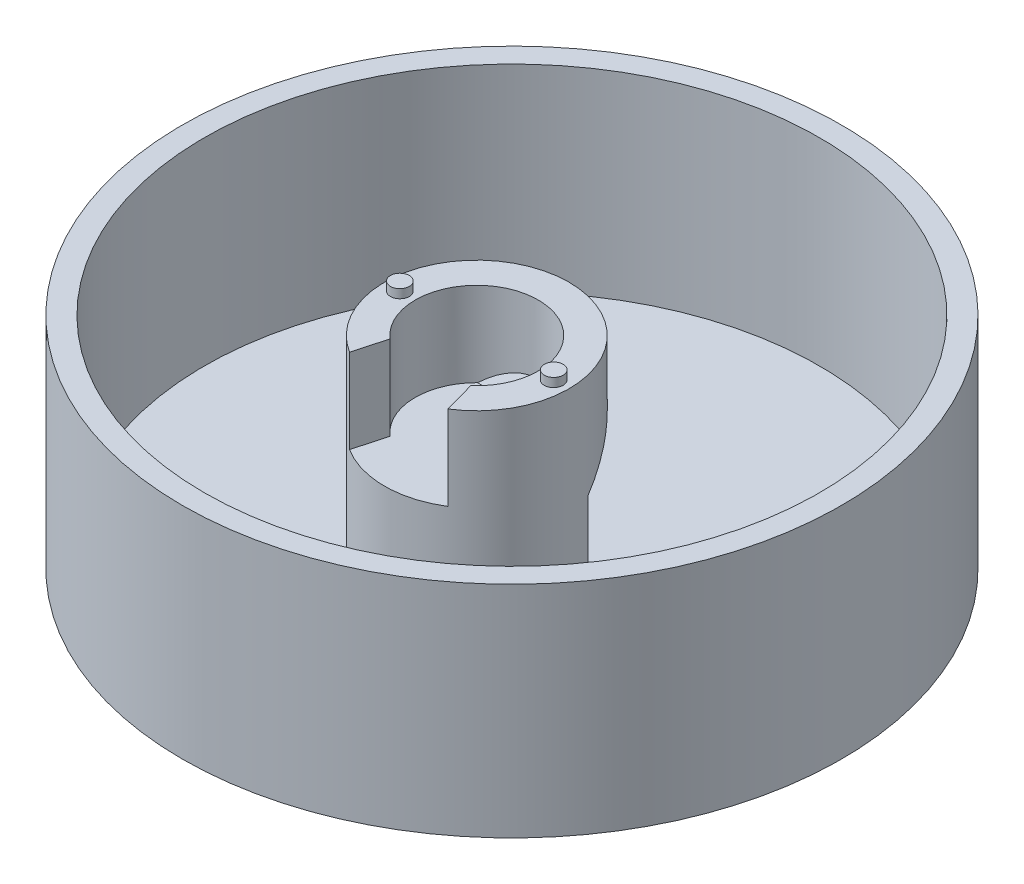
ISO-10303-21;
HEADER;
FILE_DESCRIPTION(('STEP AP214'),'2;1');
FILE_NAME('part.step','',(''),(''),'','','');
FILE_SCHEMA(('AUTOMOTIVE_DESIGN { 1 0 10303 214 1 1 1 1 }'));
ENDSEC;
DATA;
#1=APPLICATION_CONTEXT('core data for automotive mechanical design processes');
#2=APPLICATION_PROTOCOL_DEFINITION('international standard','automotive_design',2000,#1);
#3=PRODUCT_CONTEXT('',#1,'mechanical');
#4=PRODUCT('Part','Part','',(#3));
#5=PRODUCT_RELATED_PRODUCT_CATEGORY('part','',(#4));
#6=PRODUCT_DEFINITION_FORMATION('','',#4);
#7=PRODUCT_DEFINITION_CONTEXT('part definition',#1,'design');
#8=PRODUCT_DEFINITION('design','',#6,#7);
#9=PRODUCT_DEFINITION_SHAPE('','',#8);
#10=(LENGTH_UNIT() NAMED_UNIT(*) SI_UNIT(.MILLI.,.METRE.));
#11=(NAMED_UNIT(*) PLANE_ANGLE_UNIT() SI_UNIT($,.RADIAN.));
#12=(NAMED_UNIT(*) SI_UNIT($,.STERADIAN.) SOLID_ANGLE_UNIT());
#13=UNCERTAINTY_MEASURE_WITH_UNIT(LENGTH_MEASURE(1.E-05),#10,'distance_accuracy_value','');
#14=(GEOMETRIC_REPRESENTATION_CONTEXT(3) GLOBAL_UNCERTAINTY_ASSIGNED_CONTEXT((#13)) GLOBAL_UNIT_ASSIGNED_CONTEXT((#10,
#11,#12)) REPRESENTATION_CONTEXT('',''));
#15=CARTESIAN_POINT('',(0.,0.,0.));
#16=DIRECTION('',(0.,0.,1.));
#17=DIRECTION('',(1.,0.,0.));
#18=AXIS2_PLACEMENT_3D('',#15,#16,#17);
#19=CARTESIAN_POINT('',(0.,109.39696961967,8.));
#20=DIRECTION('',(0.,-1.,0.));
#21=DIRECTION('',(0.,0.,-1.));
#22=AXIS2_PLACEMENT_3D('',#19,#20,#21);
#23=CYLINDRICAL_SURFACE('',#22,21.);
#24=DIRECTION('',(0.,1.,0.));
#25=VECTOR('',#24,1.);
#26=CARTESIAN_POINT('',(11.193269132476,30.8,25.7682505083635));
#27=LINE('',#26,#25);
#28=CARTESIAN_POINT('',(11.193269132476,30.8,25.7682505083635));
#29=VERTEX_POINT('',#28);
#30=CARTESIAN_POINT('',(11.193269132476,50.,25.7682505083635));
#31=VERTEX_POINT('',#30);
#32=EDGE_CURVE('E164',#29,#31,#27,.T.);
#33=ORIENTED_EDGE('',*,*,#32,.F.);
#34=CARTESIAN_POINT('',(0.,30.8,8.));
#35=DIRECTION('',(0.,1.,0.));
#36=DIRECTION('',(0.,0.,1.));
#37=AXIS2_PLACEMENT_3D('',#34,#35,#36);
#38=CIRCLE('',#37,21.);
#39=CARTESIAN_POINT('',(-11.193269132476,30.8,25.7682505083635));
#40=VERTEX_POINT('',#39);
#41=EDGE_CURVE('E151',#40,#29,#38,.T.);
#42=ORIENTED_EDGE('',*,*,#41,.F.);
#43=DIRECTION('',(0.,1.,0.));
#44=VECTOR('',#43,1.);
#45=CARTESIAN_POINT('',(-11.193269132476,30.8,25.7682505083635));
#46=LINE('',#45,#44);
#47=CARTESIAN_POINT('',(-11.193269132476,50.,25.7682505083635));
#48=VERTEX_POINT('',#47);
#49=EDGE_CURVE('E166',#40,#48,#46,.T.);
#50=ORIENTED_EDGE('',*,*,#49,.T.);
#51=CARTESIAN_POINT('',(0.,50.,8.));
#52=DIRECTION('',(0.,1.,0.));
#53=DIRECTION('',(0.,0.,1.));
#54=AXIS2_PLACEMENT_3D('',#51,#52,#53);
#55=CIRCLE('',#54,21.);
#56=EDGE_CURVE('E176',#31,#48,#55,.T.);
#57=ORIENTED_EDGE('',*,*,#56,.F.);
#58=EDGE_LOOP('',(#33,#42,#50,#57));
#59=FACE_BOUND('',#58,.T.);
#60=DIRECTION('',(0.,-1.,0.));
#61=VECTOR('',#60,1.);
#62=CARTESIAN_POINT('',(20.4398508254369,109.39696961967,3.18206494088126));
#63=LINE('',#62,#61);
#64=CARTESIAN_POINT('',(20.4398508254369,26.1434646663157,3.18206494088126));
#65=VERTEX_POINT('',#64);
#66=CARTESIAN_POINT('',(20.4398508254369,5.,3.18206494088126));
#67=VERTEX_POINT('',#66);
#68=EDGE_CURVE('E127',#65,#67,#63,.T.);
#69=ORIENTED_EDGE('',*,*,#68,.F.);
#70=CARTESIAN_POINT('',(0.,21.7968996907606,8.));
#71=DIRECTION('',(0.,-0.742494873925477,-0.669851746429305));
#72=DIRECTION('',(0.,-0.669851746429305,0.742494873925477));
#73=AXIS2_PLACEMENT_3D('',#70,#71,#72);
#74=ELLIPSE('',#73,28.2830235432814,21.);
#75=CARTESIAN_POINT('',(-20.4398508254369,26.1434646663157,3.18206494088127));
#76=VERTEX_POINT('',#75);
#77=EDGE_CURVE('E128',#76,#65,#74,.T.);
#78=ORIENTED_EDGE('',*,*,#77,.F.);
#79=DIRECTION('',(0.,-1.,0.));
#80=VECTOR('',#79,1.);
#81=CARTESIAN_POINT('',(-20.4398508254369,109.39696961967,3.18206494088127));
#82=LINE('',#81,#80);
#83=CARTESIAN_POINT('',(-20.4398508254369,5.,3.18206494088127));
#84=VERTEX_POINT('',#83);
#85=EDGE_CURVE('E116',#84,#76,#82,.F.);
#86=ORIENTED_EDGE('',*,*,#85,.F.);
#87=CARTESIAN_POINT('',(0.,5.,8.));
#88=DIRECTION('',(0.,1.,0.));
#89=DIRECTION('',(0.,0.,1.));
#90=AXIS2_PLACEMENT_3D('',#87,#88,#89);
#91=CIRCLE('',#90,21.);
#92=EDGE_CURVE('E163',#84,#67,#91,.T.);
#93=ORIENTED_EDGE('',*,*,#92,.T.);
#94=EDGE_LOOP('',(#69,#78,#86,#93));
#95=FACE_BOUND('',#94,.T.);
#96=ADVANCED_FACE('F58',(#59,#95),#23,.T.);
#97=CARTESIAN_POINT('',(0.,30.8,0.));
#98=DIRECTION('',(0.,1.,0.));
#99=DIRECTION('',(0.,0.,1.));
#100=AXIS2_PLACEMENT_3D('',#97,#98,#99);
#101=PLANE('',#100);
#102=CARTESIAN_POINT('',(0.,30.8,8.));
#103=DIRECTION('',(0.,1.,0.));
#104=DIRECTION('',(0.,0.,1.));
#105=AXIS2_PLACEMENT_3D('',#102,#103,#104);
#106=CIRCLE('',#105,14.);
#107=CARTESIAN_POINT('',(9.20000000000001,30.8,18.5527247666183));
#108=VERTEX_POINT('',#107);
#109=CARTESIAN_POINT('',(9.81888302874048,30.8,-1.97945569998245));
#110=VERTEX_POINT('',#109);
#111=EDGE_CURVE('E159',#108,#110,#106,.T.);
#112=ORIENTED_EDGE('',*,*,#111,.T.);
#113=DIRECTION('',(-1.,0.,0.));
#114=VECTOR('',#113,1.);
#115=CARTESIAN_POINT('',(0.,30.8,-1.97945569998245));
#116=LINE('',#115,#114);
#117=CARTESIAN_POINT('',(-9.81888302874048,30.8,-1.97945569998245));
#118=VERTEX_POINT('',#117);
#119=EDGE_CURVE('E71',#110,#118,#116,.T.);
#120=ORIENTED_EDGE('',*,*,#119,.T.);
#121=CARTESIAN_POINT('',(-9.19999999999999,30.8,18.5527247666183));
#122=VERTEX_POINT('',#121);
#123=EDGE_CURVE('E172',#118,#122,#106,.T.);
#124=ORIENTED_EDGE('',*,*,#123,.T.);
#125=DIRECTION('',(-0.266273998808663,0.,0.963897379163594));
#126=VECTOR('',#125,1.);
#127=CARTESIAN_POINT('',(-3.78594569081694,30.8,-1.04585707997361));
#128=LINE('',#127,#126);
#129=EDGE_CURVE('E148',#122,#40,#128,.T.);
#130=ORIENTED_EDGE('',*,*,#129,.T.);
#131=ORIENTED_EDGE('',*,*,#41,.T.);
#132=DIRECTION('',(0.266273998808663,0.,0.963897379163594));
#133=VECTOR('',#132,1.);
#134=CARTESIAN_POINT('',(3.78594569081695,30.8,-1.04585707997361));
#135=LINE('',#134,#133);
#136=EDGE_CURVE('E154',#108,#29,#135,.T.);
#137=ORIENTED_EDGE('',*,*,#136,.F.);
#138=EDGE_LOOP('',(#112,#120,#124,#130,#131,#137));
#139=FACE_BOUND('',#138,.T.);
#140=ADVANCED_FACE('F219',(#139),#101,.T.);
#141=CARTESIAN_POINT('',(0.,30.8,8.));
#142=DIRECTION('',(0.,1.,0.));
#143=DIRECTION('',(0.,0.,1.));
#144=AXIS2_PLACEMENT_3D('',#141,#142,#143);
#145=CYLINDRICAL_SURFACE('',#144,14.);
#146=CARTESIAN_POINT('',(0.,21.7968996907606,8.));
#147=DIRECTION('',(0.,-0.742494873925477,-0.669851746429305));
#148=DIRECTION('',(0.,0.669851746429305,-0.742494873925477));
#149=AXIS2_PLACEMENT_3D('',#146,#147,#148);
#150=ELLIPSE('',#149,18.8553490288542,14.);
#151=EDGE_CURVE('E12',#110,#118,#150,.F.);
#152=ORIENTED_EDGE('',*,*,#151,.F.);
#153=ORIENTED_EDGE('',*,*,#111,.F.);
#154=DIRECTION('',(0.,1.,0.));
#155=VECTOR('',#154,1.);
#156=CARTESIAN_POINT('',(9.20000000000001,30.8,18.5527247666183));
#157=LINE('',#156,#155);
#158=CARTESIAN_POINT('',(9.2,50.,18.5527247666183));
#159=VERTEX_POINT('',#158);
#160=EDGE_CURVE('E161',#108,#159,#157,.T.);
#161=ORIENTED_EDGE('',*,*,#160,.T.);
#162=CARTESIAN_POINT('',(0.,50.,8.));
#163=DIRECTION('',(0.,1.,0.));
#164=DIRECTION('',(0.,0.,1.));
#165=AXIS2_PLACEMENT_3D('',#162,#163,#164);
#166=CIRCLE('',#165,14.);
#167=CARTESIAN_POINT('',(-9.19999999999999,50.,18.5527247666183));
#168=VERTEX_POINT('',#167);
#169=EDGE_CURVE('E142',#159,#168,#166,.T.);
#170=ORIENTED_EDGE('',*,*,#169,.T.);
#171=DIRECTION('',(0.,1.,0.));
#172=VECTOR('',#171,1.);
#173=CARTESIAN_POINT('',(-9.19999999999999,30.8,18.5527247666183));
#174=LINE('',#173,#172);
#175=EDGE_CURVE('E156',#122,#168,#174,.T.);
#176=ORIENTED_EDGE('',*,*,#175,.F.);
#177=ORIENTED_EDGE('',*,*,#123,.F.);
#178=EDGE_LOOP('',(#152,#153,#161,#170,#176,#177));
#179=FACE_BOUND('',#178,.T.);
#180=ADVANCED_FACE('F198',(#179),#145,.F.);
#181=CARTESIAN_POINT('',(0.,50.,0.));
#182=DIRECTION('',(0.,1.,0.));
#183=DIRECTION('',(0.,0.,1.));
#184=AXIS2_PLACEMENT_3D('',#181,#182,#183);
#185=PLANE('',#184);
#186=ORIENTED_EDGE('',*,*,#169,.F.);
#187=DIRECTION('',(0.266273998808663,0.,0.963897379163594));
#188=VECTOR('',#187,1.);
#189=CARTESIAN_POINT('',(3.78594569081695,50.,-1.04585707997361));
#190=LINE('',#189,#188);
#191=EDGE_CURVE('E79',#159,#31,#190,.T.);
#192=ORIENTED_EDGE('',*,*,#191,.T.);
#193=ORIENTED_EDGE('',*,*,#56,.T.);
#194=DIRECTION('',(-0.266273998808663,0.,0.963897379163594));
#195=VECTOR('',#194,1.);
#196=CARTESIAN_POINT('',(-3.78594569081694,50.,-1.04585707997361));
#197=LINE('',#196,#195);
#198=EDGE_CURVE('E157',#168,#48,#197,.T.);
#199=ORIENTED_EDGE('',*,*,#198,.F.);
#200=EDGE_LOOP('',(#186,#192,#193,#199));
#201=FACE_BOUND('',#200,.T.);
#202=CARTESIAN_POINT('',(17.5,50.,8.));
#203=DIRECTION('',(0.,1.,0.));
#204=DIRECTION('',(0.,0.,1.));
#205=AXIS2_PLACEMENT_3D('',#202,#203,#204);
#206=CIRCLE('',#205,2.15);
#207=CARTESIAN_POINT('',(17.5,50.,10.15));
#208=VERTEX_POINT('',#207);
#209=EDGE_CURVE('E66',#208,#208,#206,.T.);
#210=ORIENTED_EDGE('',*,*,#209,.F.);
#211=EDGE_LOOP('',(#210));
#212=FACE_BOUND('',#211,.T.);
#213=CARTESIAN_POINT('',(-17.5,50.,8.));
#214=DIRECTION('',(0.,1.,0.));
#215=DIRECTION('',(0.,0.,1.));
#216=AXIS2_PLACEMENT_3D('',#213,#214,#215);
#217=CIRCLE('',#216,2.15);
#218=CARTESIAN_POINT('',(-17.5,50.,10.15));
#219=VERTEX_POINT('',#218);
#220=EDGE_CURVE('E143',#219,#219,#217,.T.);
#221=ORIENTED_EDGE('',*,*,#220,.F.);
#222=EDGE_LOOP('',(#221));
#223=FACE_BOUND('',#222,.T.);
#224=ADVANCED_FACE('F195',(#201,#212,#223),#185,.T.);
#225=CARTESIAN_POINT('',(0.,50.,0.));
#226=DIRECTION('',(0.,-1.,0.));
#227=DIRECTION('',(0.,0.,-1.));
#228=AXIS2_PLACEMENT_3D('',#225,#226,#227);
#229=CYLINDRICAL_SURFACE('',#228,75.);
#230=CARTESIAN_POINT('',(0.,50.,0.));
#231=DIRECTION('',(0.,1.,0.));
#232=DIRECTION('',(0.,0.,1.));
#233=AXIS2_PLACEMENT_3D('',#230,#231,#232);
#234=CIRCLE('',#233,75.);
#235=CARTESIAN_POINT('',(0.,50.,75.));
#236=VERTEX_POINT('',#235);
#237=EDGE_CURVE('E186',#236,#236,#234,.T.);
#238=ORIENTED_EDGE('',*,*,#237,.F.);
#239=EDGE_LOOP('',(#238));
#240=FACE_BOUND('',#239,.T.);
#241=CARTESIAN_POINT('',(0.,0.,0.));
#242=DIRECTION('',(0.,1.,0.));
#243=DIRECTION('',(0.,0.,1.));
#244=AXIS2_PLACEMENT_3D('',#241,#242,#243);
#245=CIRCLE('',#244,75.);
#246=CARTESIAN_POINT('',(0.,0.,75.));
#247=VERTEX_POINT('',#246);
#248=EDGE_CURVE('E185',#247,#247,#245,.T.);
#249=ORIENTED_EDGE('',*,*,#248,.T.);
#250=EDGE_LOOP('',(#249));
#251=FACE_BOUND('',#250,.T.);
#252=ADVANCED_FACE('F60',(#240,#251),#229,.T.);
#253=CARTESIAN_POINT('',(0.,50.,0.));
#254=DIRECTION('',(0.,1.,0.));
#255=DIRECTION('',(0.,0.,1.));
#256=AXIS2_PLACEMENT_3D('',#253,#254,#255);
#257=PLANE('',#256);
#258=CARTESIAN_POINT('',(0.,50.,0.));
#259=DIRECTION('',(0.,1.,0.));
#260=DIRECTION('',(0.,0.,1.));
#261=AXIS2_PLACEMENT_3D('',#258,#259,#260);
#262=CIRCLE('',#261,70.);
#263=CARTESIAN_POINT('',(0.,50.,70.));
#264=VERTEX_POINT('',#263);
#265=EDGE_CURVE('E182',#264,#264,#262,.T.);
#266=ORIENTED_EDGE('',*,*,#265,.F.);
#267=EDGE_LOOP('',(#266));
#268=FACE_BOUND('',#267,.T.);
#269=ORIENTED_EDGE('',*,*,#237,.T.);
#270=EDGE_LOOP('',(#269));
#271=FACE_BOUND('',#270,.T.);
#272=ADVANCED_FACE('F241',(#268,#271),#257,.T.);
#273=CARTESIAN_POINT('',(0.,0.,0.));
#274=DIRECTION('',(0.,1.,0.));
#275=DIRECTION('',(0.,0.,1.));
#276=AXIS2_PLACEMENT_3D('',#273,#274,#275);
#277=PLANE('',#276);
#278=ORIENTED_EDGE('',*,*,#248,.F.);
#279=EDGE_LOOP('',(#278));
#280=FACE_BOUND('',#279,.T.);
#281=ADVANCED_FACE('F235',(#280),#277,.F.);
#282=CARTESIAN_POINT('',(0.,50.,0.));
#283=DIRECTION('',(0.,-1.,0.));
#284=DIRECTION('',(0.,0.,-1.));
#285=AXIS2_PLACEMENT_3D('',#282,#283,#284);
#286=CYLINDRICAL_SURFACE('',#285,70.);
#287=ORIENTED_EDGE('',*,*,#265,.T.);
#288=EDGE_LOOP('',(#287));
#289=FACE_BOUND('',#288,.T.);
#290=CARTESIAN_POINT('',(0.,5.,0.));
#291=DIRECTION('',(0.,1.,0.));
#292=DIRECTION('',(0.,0.,1.));
#293=AXIS2_PLACEMENT_3D('',#290,#291,#292);
#294=CIRCLE('',#293,70.);
#295=CARTESIAN_POINT('',(0.,5.,70.));
#296=VERTEX_POINT('',#295);
#297=EDGE_CURVE('E179',#296,#296,#294,.T.);
#298=ORIENTED_EDGE('',*,*,#297,.F.);
#299=EDGE_LOOP('',(#298));
#300=FACE_BOUND('',#299,.T.);
#301=ADVANCED_FACE('F231',(#289,#300),#286,.F.);
#302=CARTESIAN_POINT('',(0.,5.,0.));
#303=DIRECTION('',(0.,1.,0.));
#304=DIRECTION('',(0.,0.,1.));
#305=AXIS2_PLACEMENT_3D('',#302,#303,#304);
#306=PLANE('',#305);
#307=ORIENTED_EDGE('',*,*,#92,.F.);
#308=DIRECTION('',(1.,0.,0.));
#309=VECTOR('',#308,1.);
#310=CARTESIAN_POINT('',(-32.,5.,3.18206494088128));
#311=LINE('',#310,#309);
#312=EDGE_CURVE('E122',#84,#67,#311,.T.);
#313=ORIENTED_EDGE('',*,*,#312,.T.);
#314=EDGE_LOOP('',(#307,#313));
#315=FACE_BOUND('',#314,.T.);
#316=ORIENTED_EDGE('',*,*,#297,.T.);
#317=EDGE_LOOP('',(#316));
#318=FACE_BOUND('',#317,.T.);
#319=ADVANCED_FACE('F234',(#315,#318),#306,.T.);
#320=CARTESIAN_POINT('',(3.78594569081695,30.8,-1.04585707997361));
#321=DIRECTION('',(-0.963897379163594,0.,0.266273998808663));
#322=DIRECTION('',(0.266273998808663,0.,0.963897379163594));
#323=AXIS2_PLACEMENT_3D('',#320,#321,#322);
#324=PLANE('',#323);
#325=ORIENTED_EDGE('',*,*,#191,.F.);
#326=ORIENTED_EDGE('',*,*,#160,.F.);
#327=ORIENTED_EDGE('',*,*,#136,.T.);
#328=ORIENTED_EDGE('',*,*,#32,.T.);
#329=EDGE_LOOP('',(#325,#326,#327,#328));
#330=FACE_BOUND('',#329,.T.);
#331=ADVANCED_FACE('F239',(#330),#324,.T.);
#332=CARTESIAN_POINT('',(-3.78594569081694,30.8,-1.04585707997361));
#333=DIRECTION('',(-0.963897379163594,0.,-0.266273998808663));
#334=DIRECTION('',(-0.266273998808663,0.,0.963897379163594));
#335=AXIS2_PLACEMENT_3D('',#332,#333,#334);
#336=PLANE('',#335);
#337=ORIENTED_EDGE('',*,*,#198,.T.);
#338=ORIENTED_EDGE('',*,*,#49,.F.);
#339=ORIENTED_EDGE('',*,*,#129,.F.);
#340=ORIENTED_EDGE('',*,*,#175,.T.);
#341=EDGE_LOOP('',(#337,#338,#339,#340));
#342=FACE_BOUND('',#341,.T.);
#343=ADVANCED_FACE('F291',(#342),#336,.F.);
#344=CARTESIAN_POINT('',(17.5,52.,8.));
#345=DIRECTION('',(0.,-1.,0.));
#346=DIRECTION('',(0.,0.,-1.));
#347=AXIS2_PLACEMENT_3D('',#344,#345,#346);
#348=CYLINDRICAL_SURFACE('',#347,2.15);
#349=CARTESIAN_POINT('',(17.5,52.,8.));
#350=DIRECTION('',(0.,1.,0.));
#351=DIRECTION('',(0.,0.,1.));
#352=AXIS2_PLACEMENT_3D('',#349,#350,#351);
#353=CIRCLE('',#352,2.15);
#354=CARTESIAN_POINT('',(17.5,52.,10.15));
#355=VERTEX_POINT('',#354);
#356=EDGE_CURVE('E138',#355,#355,#353,.F.);
#357=ORIENTED_EDGE('',*,*,#356,.T.);
#358=EDGE_LOOP('',(#357));
#359=FACE_BOUND('',#358,.T.);
#360=ORIENTED_EDGE('',*,*,#209,.T.);
#361=EDGE_LOOP('',(#360));
#362=FACE_BOUND('',#361,.T.);
#363=ADVANCED_FACE('F193',(#359,#362),#348,.T.);
#364=CARTESIAN_POINT('',(0.,52.,0.));
#365=DIRECTION('',(0.,1.,0.));
#366=DIRECTION('',(0.,0.,1.));
#367=AXIS2_PLACEMENT_3D('',#364,#365,#366);
#368=PLANE('',#367);
#369=ORIENTED_EDGE('',*,*,#356,.F.);
#370=EDGE_LOOP('',(#369));
#371=FACE_BOUND('',#370,.T.);
#372=ADVANCED_FACE('F206',(#371),#368,.T.);
#373=CARTESIAN_POINT('',(-17.5,52.,8.));
#374=DIRECTION('',(0.,-1.,0.));
#375=DIRECTION('',(0.,0.,-1.));
#376=AXIS2_PLACEMENT_3D('',#373,#374,#375);
#377=CYLINDRICAL_SURFACE('',#376,2.15);
#378=CARTESIAN_POINT('',(-17.5,52.,8.));
#379=DIRECTION('',(0.,1.,0.));
#380=DIRECTION('',(0.,0.,1.));
#381=AXIS2_PLACEMENT_3D('',#378,#379,#380);
#382=CIRCLE('',#381,2.15);
#383=CARTESIAN_POINT('',(-17.5,52.,10.15));
#384=VERTEX_POINT('',#383);
#385=EDGE_CURVE('E139',#384,#384,#382,.T.);
#386=ORIENTED_EDGE('',*,*,#385,.F.);
#387=EDGE_LOOP('',(#386));
#388=FACE_BOUND('',#387,.T.);
#389=ORIENTED_EDGE('',*,*,#220,.T.);
#390=EDGE_LOOP('',(#389));
#391=FACE_BOUND('',#390,.T.);
#392=ADVANCED_FACE('F203',(#388,#391),#377,.T.);
#393=CARTESIAN_POINT('',(0.,52.,0.));
#394=DIRECTION('',(0.,1.,0.));
#395=DIRECTION('',(0.,0.,1.));
#396=AXIS2_PLACEMENT_3D('',#393,#394,#395);
#397=PLANE('',#396);
#398=ORIENTED_EDGE('',*,*,#385,.T.);
#399=EDGE_LOOP('',(#398));
#400=FACE_BOUND('',#399,.T.);
#401=ADVANCED_FACE('F205',(#400),#397,.T.);
#402=CARTESIAN_POINT('',(-32.,5.,3.18206494088128));
#403=DIRECTION('',(0.,0.,-1.));
#404=DIRECTION('',(-1.,0.,0.));
#405=AXIS2_PLACEMENT_3D('',#402,#403,#404);
#406=PLANE('',#405);
#407=ORIENTED_EDGE('',*,*,#68,.T.);
#408=ORIENTED_EDGE('',*,*,#312,.F.);
#409=ORIENTED_EDGE('',*,*,#85,.T.);
#410=DIRECTION('',(1.,0.,0.));
#411=VECTOR('',#410,1.);
#412=CARTESIAN_POINT('',(-32.,26.1434646663157,3.18206494088128));
#413=LINE('',#412,#411);
#414=EDGE_CURVE('E119',#76,#65,#413,.T.);
#415=ORIENTED_EDGE('',*,*,#414,.T.);
#416=EDGE_LOOP('',(#407,#408,#409,#415));
#417=FACE_BOUND('',#416,.T.);
#418=ADVANCED_FACE('F118',(#417),#406,.T.);
#419=CARTESIAN_POINT('',(-32.,26.1434646663157,3.18206494088128));
#420=DIRECTION('',(0.,-0.742494873925477,-0.669851746429305));
#421=DIRECTION('',(0.,0.669851746429305,-0.742494873925477));
#422=AXIS2_PLACEMENT_3D('',#419,#420,#421);
#423=PLANE('',#422);
#424=ORIENTED_EDGE('',*,*,#151,.T.);
#425=ORIENTED_EDGE('',*,*,#119,.F.);
#426=EDGE_LOOP('',(#424,#425));
#427=FACE_BOUND('',#426,.T.);
#428=ORIENTED_EDGE('',*,*,#77,.T.);
#429=ORIENTED_EDGE('',*,*,#414,.F.);
#430=EDGE_LOOP('',(#428,#429));
#431=FACE_BOUND('',#430,.T.);
#432=ADVANCED_FACE('F131',(#427,#431),#423,.T.);
#433=CLOSED_SHELL('',(#96,#140,#180,#224,#252,#272,#281,#301,#319,#331,#343,#363,#372,#392,#401,
#418,#432));
#434=MANIFOLD_SOLID_BREP('B2',#433);
#435=ADVANCED_BREP_SHAPE_REPRESENTATION('',(#18,#434),#14);
#436=SHAPE_DEFINITION_REPRESENTATION(#9,#435);
ENDSEC;
END-ISO-10303-21;
